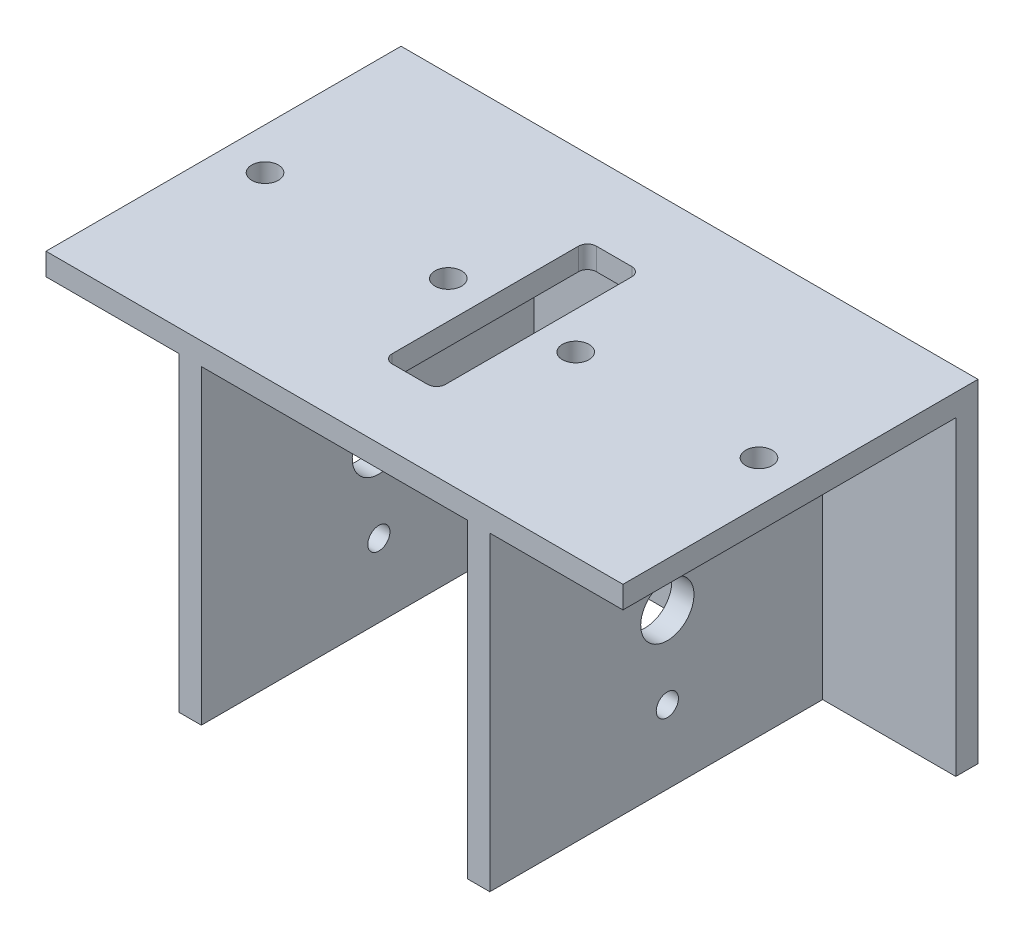
ISO-10303-21;
HEADER;
FILE_DESCRIPTION(('STEP AP214'),'2;1');
FILE_NAME('part.step','',(''),(''),'','','');
FILE_SCHEMA(('AUTOMOTIVE_DESIGN { 1 0 10303 214 1 1 1 1 }'));
ENDSEC;
DATA;
#1=APPLICATION_CONTEXT('core data for automotive mechanical design processes');
#2=APPLICATION_PROTOCOL_DEFINITION('international standard','automotive_design',2000,#1);
#3=PRODUCT_CONTEXT('',#1,'mechanical');
#4=PRODUCT('Part','Part','',(#3));
#5=PRODUCT_RELATED_PRODUCT_CATEGORY('part','',(#4));
#6=PRODUCT_DEFINITION_FORMATION('','',#4);
#7=PRODUCT_DEFINITION_CONTEXT('part definition',#1,'design');
#8=PRODUCT_DEFINITION('design','',#6,#7);
#9=PRODUCT_DEFINITION_SHAPE('','',#8);
#10=(LENGTH_UNIT() NAMED_UNIT(*) SI_UNIT(.MILLI.,.METRE.));
#11=(NAMED_UNIT(*) PLANE_ANGLE_UNIT() SI_UNIT($,.RADIAN.));
#12=(NAMED_UNIT(*) SI_UNIT($,.STERADIAN.) SOLID_ANGLE_UNIT());
#13=UNCERTAINTY_MEASURE_WITH_UNIT(LENGTH_MEASURE(1.E-05),#10,'distance_accuracy_value','');
#14=(GEOMETRIC_REPRESENTATION_CONTEXT(3) GLOBAL_UNCERTAINTY_ASSIGNED_CONTEXT((#13)) GLOBAL_UNIT_ASSIGNED_CONTEXT((#10,
#11,#12)) REPRESENTATION_CONTEXT('',''));
#15=CARTESIAN_POINT('',(0.,0.,0.));
#16=DIRECTION('',(0.,0.,1.));
#17=DIRECTION('',(1.,0.,0.));
#18=AXIS2_PLACEMENT_3D('',#15,#16,#17);
#19=CARTESIAN_POINT('',(0.,0.,0.));
#20=DIRECTION('',(0.,-1.,0.));
#21=DIRECTION('',(0.,0.,-1.));
#22=AXIS2_PLACEMENT_3D('',#19,#20,#21);
#23=PLANE('',#22);
#24=CARTESIAN_POINT('',(-14.35,0.,0.));
#25=DIRECTION('',(0.,1.,0.));
#26=DIRECTION('',(0.,0.,1.));
#27=AXIS2_PLACEMENT_3D('',#24,#25,#26);
#28=CIRCLE('',#27,3.);
#29=CARTESIAN_POINT('',(-14.35,0.,3.));
#30=VERTEX_POINT('',#29);
#31=EDGE_CURVE('E326',#30,#30,#28,.T.);
#32=ORIENTED_EDGE('',*,*,#31,.T.);
#33=EDGE_LOOP('',(#32));
#34=FACE_BOUND('',#33,.T.);
#35=CARTESIAN_POINT('',(14.35,0.,0.));
#36=DIRECTION('',(0.,1.,0.));
#37=DIRECTION('',(0.,0.,-1.));
#38=AXIS2_PLACEMENT_3D('',#35,#36,#37);
#39=CIRCLE('',#38,3.);
#40=CARTESIAN_POINT('',(14.35,0.,-3.00000000000001));
#41=VERTEX_POINT('',#40);
#42=EDGE_CURVE('E291',#41,#41,#39,.T.);
#43=ORIENTED_EDGE('',*,*,#42,.T.);
#44=EDGE_LOOP('',(#43));
#45=FACE_BOUND('',#44,.T.);
#46=DIRECTION('',(0.,0.,-1.));
#47=VECTOR('',#46,1.);
#48=CARTESIAN_POINT('',(5.99999999999999,0.,-23.));
#49=LINE('',#48,#47);
#50=CARTESIAN_POINT('',(5.99999999999999,0.,21.));
#51=VERTEX_POINT('',#50);
#52=CARTESIAN_POINT('',(5.99999999999999,0.,-21.));
#53=VERTEX_POINT('',#52);
#54=EDGE_CURVE('E299',#51,#53,#49,.T.);
#55=ORIENTED_EDGE('',*,*,#54,.T.);
#56=CARTESIAN_POINT('',(3.99999999999999,0.,-21.));
#57=DIRECTION('',(0.,-1.,0.));
#58=DIRECTION('',(0.,0.,-1.));
#59=AXIS2_PLACEMENT_3D('',#56,#57,#58);
#60=CIRCLE('',#59,2.);
#61=CARTESIAN_POINT('',(3.99999999999999,0.,-23.));
#62=VERTEX_POINT('',#61);
#63=EDGE_CURVE('E415',#53,#62,#60,.F.);
#64=ORIENTED_EDGE('',*,*,#63,.T.);
#65=DIRECTION('',(-1.,0.,0.));
#66=VECTOR('',#65,1.);
#67=CARTESIAN_POINT('',(5.99999999999999,0.,-23.));
#68=LINE('',#67,#66);
#69=CARTESIAN_POINT('',(-4.,0.,-23.));
#70=VERTEX_POINT('',#69);
#71=EDGE_CURVE('E279',#62,#70,#68,.T.);
#72=ORIENTED_EDGE('',*,*,#71,.T.);
#73=CARTESIAN_POINT('',(-4.,0.,-21.));
#74=DIRECTION('',(0.,-1.,0.));
#75=DIRECTION('',(0.,0.,-1.));
#76=AXIS2_PLACEMENT_3D('',#73,#74,#75);
#77=CIRCLE('',#76,2.);
#78=CARTESIAN_POINT('',(-6.,0.,-21.));
#79=VERTEX_POINT('',#78);
#80=EDGE_CURVE('E53',#70,#79,#77,.F.);
#81=ORIENTED_EDGE('',*,*,#80,.T.);
#82=DIRECTION('',(0.,0.,1.));
#83=VECTOR('',#82,1.);
#84=CARTESIAN_POINT('',(-6.,0.,-23.));
#85=LINE('',#84,#83);
#86=CARTESIAN_POINT('',(-6.,0.,21.));
#87=VERTEX_POINT('',#86);
#88=EDGE_CURVE('E271',#79,#87,#85,.T.);
#89=ORIENTED_EDGE('',*,*,#88,.T.);
#90=CARTESIAN_POINT('',(-4.,0.,21.));
#91=DIRECTION('',(0.,-1.,0.));
#92=DIRECTION('',(0.,0.,-1.));
#93=AXIS2_PLACEMENT_3D('',#90,#91,#92);
#94=CIRCLE('',#93,2.);
#95=CARTESIAN_POINT('',(-4.,0.,23.));
#96=VERTEX_POINT('',#95);
#97=EDGE_CURVE('E409',#87,#96,#94,.F.);
#98=ORIENTED_EDGE('',*,*,#97,.T.);
#99=DIRECTION('',(1.,0.,0.));
#100=VECTOR('',#99,1.);
#101=CARTESIAN_POINT('',(5.99999999999999,0.,23.));
#102=LINE('',#101,#100);
#103=CARTESIAN_POINT('',(3.99999999999999,0.,23.));
#104=VERTEX_POINT('',#103);
#105=EDGE_CURVE('E295',#96,#104,#102,.T.);
#106=ORIENTED_EDGE('',*,*,#105,.T.);
#107=CARTESIAN_POINT('',(3.99999999999999,0.,21.));
#108=DIRECTION('',(0.,-1.,0.));
#109=DIRECTION('',(0.,0.,-1.));
#110=AXIS2_PLACEMENT_3D('',#107,#108,#109);
#111=CIRCLE('',#110,2.);
#112=EDGE_CURVE('E403',#104,#51,#111,.F.);
#113=ORIENTED_EDGE('',*,*,#112,.T.);
#114=EDGE_LOOP('',(#55,#64,#72,#81,#89,#98,#106,#113));
#115=FACE_BOUND('',#114,.T.);
#116=DIRECTION('',(-1.,0.,0.));
#117=VECTOR('',#116,1.);
#118=CARTESIAN_POINT('',(-65.,0.,-35.));
#119=LINE('',#118,#117);
#120=CARTESIAN_POINT('',(30.,0.,-35.));
#121=VERTEX_POINT('',#120);
#122=CARTESIAN_POINT('',(-30.,0.,-35.));
#123=VERTEX_POINT('',#122);
#124=EDGE_CURVE('E226',#121,#123,#119,.T.);
#125=ORIENTED_EDGE('',*,*,#124,.F.);
#126=DIRECTION('',(0.,0.,-1.));
#127=VECTOR('',#126,1.);
#128=CARTESIAN_POINT('',(30.,0.,40.));
#129=LINE('',#128,#127);
#130=CARTESIAN_POINT('',(30.,0.,40.));
#131=VERTEX_POINT('',#130);
#132=EDGE_CURVE('E468',#131,#121,#129,.T.);
#133=ORIENTED_EDGE('',*,*,#132,.F.);
#134=DIRECTION('',(1.,0.,0.));
#135=VECTOR('',#134,1.);
#136=CARTESIAN_POINT('',(65.,0.,40.));
#137=LINE('',#136,#135);
#138=CARTESIAN_POINT('',(-30.,0.,40.));
#139=VERTEX_POINT('',#138);
#140=EDGE_CURVE('E361',#139,#131,#137,.T.);
#141=ORIENTED_EDGE('',*,*,#140,.F.);
#142=DIRECTION('',(0.,0.,-1.));
#143=VECTOR('',#142,1.);
#144=CARTESIAN_POINT('',(-30.,0.,40.));
#145=LINE('',#144,#143);
#146=EDGE_CURVE('E237',#139,#123,#145,.T.);
#147=ORIENTED_EDGE('',*,*,#146,.T.);
#148=EDGE_LOOP('',(#125,#133,#141,#147));
#149=FACE_BOUND('',#148,.T.);
#150=ADVANCED_FACE('F43',(#34,#45,#115,#149),#23,.T.);
#151=CARTESIAN_POINT('',(55.65,0.,0.));
#152=DIRECTION('',(0.,1.,0.));
#153=DIRECTION('',(0.,0.,-1.));
#154=AXIS2_PLACEMENT_3D('',#151,#152,#153);
#155=CIRCLE('',#154,3.);
#156=CARTESIAN_POINT('',(55.65,0.,-3.00000000000001));
#157=VERTEX_POINT('',#156);
#158=EDGE_CURVE('E310',#157,#157,#155,.T.);
#159=ORIENTED_EDGE('',*,*,#158,.T.);
#160=EDGE_LOOP('',(#159));
#161=FACE_BOUND('',#160,.T.);
#162=CARTESIAN_POINT('',(35.,0.,40.));
#163=VERTEX_POINT('',#162);
#164=CARTESIAN_POINT('',(65.,0.,40.));
#165=VERTEX_POINT('',#164);
#166=EDGE_CURVE('E216',#163,#165,#137,.T.);
#167=ORIENTED_EDGE('',*,*,#166,.F.);
#168=DIRECTION('',(0.,0.,-1.));
#169=VECTOR('',#168,1.);
#170=CARTESIAN_POINT('',(35.,0.,40.));
#171=LINE('',#170,#169);
#172=CARTESIAN_POINT('',(35.,0.,-35.));
#173=VERTEX_POINT('',#172);
#174=EDGE_CURVE('E199',#163,#173,#171,.T.);
#175=ORIENTED_EDGE('',*,*,#174,.T.);
#176=CARTESIAN_POINT('',(65.,0.,-35.));
#177=VERTEX_POINT('',#176);
#178=EDGE_CURVE('E214',#177,#173,#119,.T.);
#179=ORIENTED_EDGE('',*,*,#178,.F.);
#180=DIRECTION('',(0.,0.,-1.));
#181=VECTOR('',#180,1.);
#182=CARTESIAN_POINT('',(65.,0.,-40.));
#183=LINE('',#182,#181);
#184=EDGE_CURVE('E334',#165,#177,#183,.T.);
#185=ORIENTED_EDGE('',*,*,#184,.F.);
#186=EDGE_LOOP('',(#167,#175,#179,#185));
#187=FACE_BOUND('',#186,.T.);
#188=ADVANCED_FACE('F212',(#161,#187),#23,.T.);
#189=CARTESIAN_POINT('',(-65.,-70.,-35.));
#190=DIRECTION('',(0.,0.,-1.));
#191=DIRECTION('',(-1.,0.,0.));
#192=AXIS2_PLACEMENT_3D('',#189,#190,#191);
#193=PLANE('',#192);
#194=DIRECTION('',(0.,-1.,0.));
#195=VECTOR('',#194,1.);
#196=CARTESIAN_POINT('',(30.,0.,-35.));
#197=LINE('',#196,#195);
#198=CARTESIAN_POINT('',(30.,-70.,-35.));
#199=VERTEX_POINT('',#198);
#200=EDGE_CURVE('E208',#121,#199,#197,.T.);
#201=ORIENTED_EDGE('',*,*,#200,.F.);
#202=ORIENTED_EDGE('',*,*,#124,.T.);
#203=DIRECTION('',(0.,1.,0.));
#204=VECTOR('',#203,1.);
#205=CARTESIAN_POINT('',(-30.,0.,-35.));
#206=LINE('',#205,#204);
#207=CARTESIAN_POINT('',(-30.,-70.,-35.));
#208=VERTEX_POINT('',#207);
#209=EDGE_CURVE('E477',#208,#123,#206,.T.);
#210=ORIENTED_EDGE('',*,*,#209,.F.);
#211=DIRECTION('',(-1.,0.,0.));
#212=VECTOR('',#211,1.);
#213=CARTESIAN_POINT('',(-65.,-70.,-35.));
#214=LINE('',#213,#212);
#215=EDGE_CURVE('E261',#199,#208,#214,.T.);
#216=ORIENTED_EDGE('',*,*,#215,.F.);
#217=EDGE_LOOP('',(#201,#202,#210,#216));
#218=FACE_BOUND('',#217,.T.);
#219=ADVANCED_FACE('F533',(#218),#193,.F.);
#220=DIRECTION('',(0.,1.,0.));
#221=VECTOR('',#220,1.);
#222=CARTESIAN_POINT('',(35.,0.,-35.));
#223=LINE('',#222,#221);
#224=CARTESIAN_POINT('',(35.,-70.,-35.));
#225=VERTEX_POINT('',#224);
#226=EDGE_CURVE('E195',#225,#173,#223,.T.);
#227=ORIENTED_EDGE('',*,*,#226,.F.);
#228=CARTESIAN_POINT('',(65.,-70.,-35.));
#229=VERTEX_POINT('',#228);
#230=EDGE_CURVE('E258',#229,#225,#214,.T.);
#231=ORIENTED_EDGE('',*,*,#230,.F.);
#232=DIRECTION('',(0.,1.,0.));
#233=VECTOR('',#232,1.);
#234=CARTESIAN_POINT('',(65.,-70.,-35.));
#235=LINE('',#234,#233);
#236=EDGE_CURVE('E223',#229,#177,#235,.T.);
#237=ORIENTED_EDGE('',*,*,#236,.T.);
#238=ORIENTED_EDGE('',*,*,#178,.T.);
#239=EDGE_LOOP('',(#227,#231,#237,#238));
#240=FACE_BOUND('',#239,.T.);
#241=ADVANCED_FACE('F221',(#240),#193,.F.);
#242=CARTESIAN_POINT('',(-55.65,0.,0.));
#243=DIRECTION('',(0.,1.,0.));
#244=DIRECTION('',(0.,0.,1.));
#245=AXIS2_PLACEMENT_3D('',#242,#243,#244);
#246=CIRCLE('',#245,3.);
#247=CARTESIAN_POINT('',(-55.65,0.,3.));
#248=VERTEX_POINT('',#247);
#249=EDGE_CURVE('E318',#248,#248,#246,.T.);
#250=ORIENTED_EDGE('',*,*,#249,.T.);
#251=EDGE_LOOP('',(#250));
#252=FACE_BOUND('',#251,.T.);
#253=CARTESIAN_POINT('',(-35.,0.,-35.));
#254=VERTEX_POINT('',#253);
#255=CARTESIAN_POINT('',(-65.,0.,-35.));
#256=VERTEX_POINT('',#255);
#257=EDGE_CURVE('E228',#254,#256,#119,.T.);
#258=ORIENTED_EDGE('',*,*,#257,.F.);
#259=DIRECTION('',(0.,0.,-1.));
#260=VECTOR('',#259,1.);
#261=CARTESIAN_POINT('',(-35.,0.,40.));
#262=LINE('',#261,#260);
#263=CARTESIAN_POINT('',(-35.,0.,40.));
#264=VERTEX_POINT('',#263);
#265=EDGE_CURVE('E245',#264,#254,#262,.T.);
#266=ORIENTED_EDGE('',*,*,#265,.F.);
#267=CARTESIAN_POINT('',(-65.,0.,40.));
#268=VERTEX_POINT('',#267);
#269=EDGE_CURVE('E343',#268,#264,#137,.T.);
#270=ORIENTED_EDGE('',*,*,#269,.F.);
#271=DIRECTION('',(0.,0.,1.));
#272=VECTOR('',#271,1.);
#273=CARTESIAN_POINT('',(-65.,0.,-40.));
#274=LINE('',#273,#272);
#275=EDGE_CURVE('E355',#256,#268,#274,.T.);
#276=ORIENTED_EDGE('',*,*,#275,.F.);
#277=EDGE_LOOP('',(#258,#266,#270,#276));
#278=FACE_BOUND('',#277,.T.);
#279=ADVANCED_FACE('F565',(#252,#278),#23,.T.);
#280=DIRECTION('',(0.,-1.,0.));
#281=VECTOR('',#280,1.);
#282=CARTESIAN_POINT('',(-35.,0.,-35.));
#283=LINE('',#282,#281);
#284=CARTESIAN_POINT('',(-35.,-70.,-35.));
#285=VERTEX_POINT('',#284);
#286=EDGE_CURVE('E489',#254,#285,#283,.T.);
#287=ORIENTED_EDGE('',*,*,#286,.F.);
#288=ORIENTED_EDGE('',*,*,#257,.T.);
#289=DIRECTION('',(0.,1.,0.));
#290=VECTOR('',#289,1.);
#291=CARTESIAN_POINT('',(-65.,-70.,-35.));
#292=LINE('',#291,#290);
#293=CARTESIAN_POINT('',(-65.,-70.,-35.));
#294=VERTEX_POINT('',#293);
#295=EDGE_CURVE('E264',#294,#256,#292,.T.);
#296=ORIENTED_EDGE('',*,*,#295,.F.);
#297=EDGE_CURVE('E257',#285,#294,#214,.T.);
#298=ORIENTED_EDGE('',*,*,#297,.F.);
#299=EDGE_LOOP('',(#287,#288,#296,#298));
#300=FACE_BOUND('',#299,.T.);
#301=ADVANCED_FACE('F539',(#300),#193,.F.);
#302=CARTESIAN_POINT('',(0.,5.,0.));
#303=DIRECTION('',(0.,-1.,0.));
#304=DIRECTION('',(0.,0.,-1.));
#305=AXIS2_PLACEMENT_3D('',#302,#303,#304);
#306=PLANE('',#305);
#307=CARTESIAN_POINT('',(14.35,5.,0.));
#308=DIRECTION('',(0.,1.,0.));
#309=DIRECTION('',(0.,0.,-1.));
#310=AXIS2_PLACEMENT_3D('',#307,#308,#309);
#311=CIRCLE('',#310,3.);
#312=CARTESIAN_POINT('',(14.35,5.,-3.00000000000001));
#313=VERTEX_POINT('',#312);
#314=EDGE_CURVE('E306',#313,#313,#311,.T.);
#315=ORIENTED_EDGE('',*,*,#314,.F.);
#316=EDGE_LOOP('',(#315));
#317=FACE_BOUND('',#316,.T.);
#318=CARTESIAN_POINT('',(55.65,5.,0.));
#319=DIRECTION('',(0.,1.,0.));
#320=DIRECTION('',(0.,0.,-1.));
#321=AXIS2_PLACEMENT_3D('',#318,#319,#320);
#322=CIRCLE('',#321,3.);
#323=CARTESIAN_POINT('',(55.65,5.,-3.00000000000001));
#324=VERTEX_POINT('',#323);
#325=EDGE_CURVE('E314',#324,#324,#322,.T.);
#326=ORIENTED_EDGE('',*,*,#325,.F.);
#327=EDGE_LOOP('',(#326));
#328=FACE_BOUND('',#327,.T.);
#329=CARTESIAN_POINT('',(-55.65,5.,0.));
#330=DIRECTION('',(0.,1.,0.));
#331=DIRECTION('',(0.,0.,1.));
#332=AXIS2_PLACEMENT_3D('',#329,#330,#331);
#333=CIRCLE('',#332,3.);
#334=CARTESIAN_POINT('',(-55.65,5.,3.));
#335=VERTEX_POINT('',#334);
#336=EDGE_CURVE('E322',#335,#335,#333,.T.);
#337=ORIENTED_EDGE('',*,*,#336,.F.);
#338=EDGE_LOOP('',(#337));
#339=FACE_BOUND('',#338,.T.);
#340=CARTESIAN_POINT('',(-14.35,5.,0.));
#341=DIRECTION('',(0.,1.,0.));
#342=DIRECTION('',(0.,0.,1.));
#343=AXIS2_PLACEMENT_3D('',#340,#341,#342);
#344=CIRCLE('',#343,3.);
#345=CARTESIAN_POINT('',(-14.35,5.,3.));
#346=VERTEX_POINT('',#345);
#347=EDGE_CURVE('E330',#346,#346,#344,.T.);
#348=ORIENTED_EDGE('',*,*,#347,.F.);
#349=EDGE_LOOP('',(#348));
#350=FACE_BOUND('',#349,.T.);
#351=DIRECTION('',(0.,0.,-1.));
#352=VECTOR('',#351,1.);
#353=CARTESIAN_POINT('',(65.,5.,-40.));
#354=LINE('',#353,#352);
#355=CARTESIAN_POINT('',(65.,5.,40.));
#356=VERTEX_POINT('',#355);
#357=CARTESIAN_POINT('',(65.,5.,-40.));
#358=VERTEX_POINT('',#357);
#359=EDGE_CURVE('E338',#356,#358,#354,.T.);
#360=ORIENTED_EDGE('',*,*,#359,.T.);
#361=DIRECTION('',(-1.,0.,0.));
#362=VECTOR('',#361,1.);
#363=CARTESIAN_POINT('',(65.,5.,-40.));
#364=LINE('',#363,#362);
#365=CARTESIAN_POINT('',(-65.,5.,-40.));
#366=VERTEX_POINT('',#365);
#367=EDGE_CURVE('E342',#358,#366,#364,.T.);
#368=ORIENTED_EDGE('',*,*,#367,.T.);
#369=DIRECTION('',(0.,0.,1.));
#370=VECTOR('',#369,1.);
#371=CARTESIAN_POINT('',(-65.,5.,-40.));
#372=LINE('',#371,#370);
#373=CARTESIAN_POINT('',(-65.,5.,40.));
#374=VERTEX_POINT('',#373);
#375=EDGE_CURVE('E346',#366,#374,#372,.T.);
#376=ORIENTED_EDGE('',*,*,#375,.T.);
#377=DIRECTION('',(1.,0.,0.));
#378=VECTOR('',#377,1.);
#379=CARTESIAN_POINT('',(65.,5.,40.));
#380=LINE('',#379,#378);
#381=EDGE_CURVE('E349',#374,#356,#380,.T.);
#382=ORIENTED_EDGE('',*,*,#381,.T.);
#383=EDGE_LOOP('',(#360,#368,#376,#382));
#384=FACE_BOUND('',#383,.T.);
#385=DIRECTION('',(0.,0.,1.));
#386=VECTOR('',#385,1.);
#387=CARTESIAN_POINT('',(-6.,5.,-23.));
#388=LINE('',#387,#386);
#389=CARTESIAN_POINT('',(-6.,5.,-21.));
#390=VERTEX_POINT('',#389);
#391=CARTESIAN_POINT('',(-6.,5.,21.));
#392=VERTEX_POINT('',#391);
#393=EDGE_CURVE('E274',#390,#392,#388,.T.);
#394=ORIENTED_EDGE('',*,*,#393,.F.);
#395=CARTESIAN_POINT('',(-4.,5.,-21.));
#396=DIRECTION('',(0.,-1.,0.));
#397=DIRECTION('',(0.,0.,-1.));
#398=AXIS2_PLACEMENT_3D('',#395,#396,#397);
#399=CIRCLE('',#398,2.);
#400=CARTESIAN_POINT('',(-4.,5.,-23.));
#401=VERTEX_POINT('',#400);
#402=EDGE_CURVE('E11',#390,#401,#399,.T.);
#403=ORIENTED_EDGE('',*,*,#402,.T.);
#404=DIRECTION('',(-1.,0.,0.));
#405=VECTOR('',#404,1.);
#406=CARTESIAN_POINT('',(5.99999999999999,5.,-23.));
#407=LINE('',#406,#405);
#408=CARTESIAN_POINT('',(3.99999999999999,5.,-23.));
#409=VERTEX_POINT('',#408);
#410=EDGE_CURVE('E287',#409,#401,#407,.T.);
#411=ORIENTED_EDGE('',*,*,#410,.F.);
#412=CARTESIAN_POINT('',(3.99999999999999,5.,-21.));
#413=DIRECTION('',(0.,-1.,0.));
#414=DIRECTION('',(0.,0.,-1.));
#415=AXIS2_PLACEMENT_3D('',#412,#413,#414);
#416=CIRCLE('',#415,2.);
#417=CARTESIAN_POINT('',(5.99999999999999,5.,-21.));
#418=VERTEX_POINT('',#417);
#419=EDGE_CURVE('E418',#409,#418,#416,.T.);
#420=ORIENTED_EDGE('',*,*,#419,.T.);
#421=DIRECTION('',(0.,0.,-1.));
#422=VECTOR('',#421,1.);
#423=CARTESIAN_POINT('',(5.99999999999999,5.,-23.));
#424=LINE('',#423,#422);
#425=CARTESIAN_POINT('',(5.99999999999999,5.,21.));
#426=VERTEX_POINT('',#425);
#427=EDGE_CURVE('E283',#426,#418,#424,.T.);
#428=ORIENTED_EDGE('',*,*,#427,.F.);
#429=CARTESIAN_POINT('',(3.99999999999999,5.,21.));
#430=DIRECTION('',(0.,-1.,0.));
#431=DIRECTION('',(0.,0.,-1.));
#432=AXIS2_PLACEMENT_3D('',#429,#430,#431);
#433=CIRCLE('',#432,2.);
#434=CARTESIAN_POINT('',(3.99999999999999,5.,23.));
#435=VERTEX_POINT('',#434);
#436=EDGE_CURVE('E406',#426,#435,#433,.T.);
#437=ORIENTED_EDGE('',*,*,#436,.T.);
#438=DIRECTION('',(1.,0.,0.));
#439=VECTOR('',#438,1.);
#440=CARTESIAN_POINT('',(5.99999999999999,5.,23.));
#441=LINE('',#440,#439);
#442=CARTESIAN_POINT('',(-4.,5.,23.));
#443=VERTEX_POINT('',#442);
#444=EDGE_CURVE('E278',#443,#435,#441,.T.);
#445=ORIENTED_EDGE('',*,*,#444,.F.);
#446=CARTESIAN_POINT('',(-4.,5.,21.));
#447=DIRECTION('',(0.,-1.,0.));
#448=DIRECTION('',(0.,0.,-1.));
#449=AXIS2_PLACEMENT_3D('',#446,#447,#448);
#450=CIRCLE('',#449,2.);
#451=EDGE_CURVE('E412',#443,#392,#450,.T.);
#452=ORIENTED_EDGE('',*,*,#451,.T.);
#453=EDGE_LOOP('',(#394,#403,#411,#420,#428,#437,#445,#452));
#454=FACE_BOUND('',#453,.T.);
#455=ADVANCED_FACE('F573',(#317,#328,#339,#350,#384,#454),#306,.F.);
#456=CARTESIAN_POINT('',(65.,5.,-40.));
#457=DIRECTION('',(-1.,0.,0.));
#458=DIRECTION('',(0.,0.,1.));
#459=AXIS2_PLACEMENT_3D('',#456,#457,#458);
#460=PLANE('',#459);
#461=ORIENTED_EDGE('',*,*,#184,.T.);
#462=ORIENTED_EDGE('',*,*,#236,.F.);
#463=DIRECTION('',(0.,0.,1.));
#464=VECTOR('',#463,1.);
#465=CARTESIAN_POINT('',(65.,-70.,-35.));
#466=LINE('',#465,#464);
#467=CARTESIAN_POINT('',(65.,-70.,-40.));
#468=VERTEX_POINT('',#467);
#469=EDGE_CURVE('E232',#468,#229,#466,.T.);
#470=ORIENTED_EDGE('',*,*,#469,.F.);
#471=DIRECTION('',(0.,-1.,0.));
#472=VECTOR('',#471,1.);
#473=CARTESIAN_POINT('',(65.,5.,-40.));
#474=LINE('',#473,#472);
#475=EDGE_CURVE('E372',#358,#468,#474,.T.);
#476=ORIENTED_EDGE('',*,*,#475,.F.);
#477=ORIENTED_EDGE('',*,*,#359,.F.);
#478=DIRECTION('',(0.,-1.,0.));
#479=VECTOR('',#478,1.);
#480=CARTESIAN_POINT('',(65.,5.,40.));
#481=LINE('',#480,#479);
#482=EDGE_CURVE('E352',#356,#165,#481,.T.);
#483=ORIENTED_EDGE('',*,*,#482,.T.);
#484=EDGE_LOOP('',(#461,#462,#470,#476,#477,#483));
#485=FACE_BOUND('',#484,.T.);
#486=ADVANCED_FACE('F549',(#485),#460,.F.);
#487=CARTESIAN_POINT('',(65.,5.,-40.));
#488=DIRECTION('',(0.,0.,1.));
#489=DIRECTION('',(1.,0.,0.));
#490=AXIS2_PLACEMENT_3D('',#487,#488,#489);
#491=PLANE('',#490);
#492=ORIENTED_EDGE('',*,*,#475,.T.);
#493=DIRECTION('',(1.,0.,0.));
#494=VECTOR('',#493,1.);
#495=CARTESIAN_POINT('',(65.,-70.,-40.));
#496=LINE('',#495,#494);
#497=CARTESIAN_POINT('',(-65.,-70.,-40.));
#498=VERTEX_POINT('',#497);
#499=EDGE_CURVE('E225',#498,#468,#496,.T.);
#500=ORIENTED_EDGE('',*,*,#499,.F.);
#501=DIRECTION('',(0.,-1.,0.));
#502=VECTOR('',#501,1.);
#503=CARTESIAN_POINT('',(-65.,5.,-40.));
#504=LINE('',#503,#502);
#505=EDGE_CURVE('E369',#366,#498,#504,.T.);
#506=ORIENTED_EDGE('',*,*,#505,.F.);
#507=ORIENTED_EDGE('',*,*,#367,.F.);
#508=EDGE_LOOP('',(#492,#500,#506,#507));
#509=FACE_BOUND('',#508,.T.);
#510=ADVANCED_FACE('F545',(#509),#491,.F.);
#511=CARTESIAN_POINT('',(-65.,5.,-40.));
#512=DIRECTION('',(1.,0.,0.));
#513=DIRECTION('',(0.,0.,-1.));
#514=AXIS2_PLACEMENT_3D('',#511,#512,#513);
#515=PLANE('',#514);
#516=ORIENTED_EDGE('',*,*,#505,.T.);
#517=DIRECTION('',(0.,0.,-1.));
#518=VECTOR('',#517,1.);
#519=CARTESIAN_POINT('',(-65.,-70.,-40.));
#520=LINE('',#519,#518);
#521=EDGE_CURVE('E260',#294,#498,#520,.T.);
#522=ORIENTED_EDGE('',*,*,#521,.F.);
#523=ORIENTED_EDGE('',*,*,#295,.T.);
#524=ORIENTED_EDGE('',*,*,#275,.T.);
#525=DIRECTION('',(0.,-1.,0.));
#526=VECTOR('',#525,1.);
#527=CARTESIAN_POINT('',(-65.,5.,40.));
#528=LINE('',#527,#526);
#529=EDGE_CURVE('E365',#374,#268,#528,.T.);
#530=ORIENTED_EDGE('',*,*,#529,.F.);
#531=ORIENTED_EDGE('',*,*,#375,.F.);
#532=EDGE_LOOP('',(#516,#522,#523,#524,#530,#531));
#533=FACE_BOUND('',#532,.T.);
#534=ADVANCED_FACE('F540',(#533),#515,.F.);
#535=CARTESIAN_POINT('',(65.,5.,40.));
#536=DIRECTION('',(0.,0.,-1.));
#537=DIRECTION('',(-1.,0.,0.));
#538=AXIS2_PLACEMENT_3D('',#535,#536,#537);
#539=PLANE('',#538);
#540=ORIENTED_EDGE('',*,*,#269,.T.);
#541=DIRECTION('',(0.,-1.,0.));
#542=VECTOR('',#541,1.);
#543=CARTESIAN_POINT('',(-35.,0.,40.));
#544=LINE('',#543,#542);
#545=CARTESIAN_POINT('',(-35.,-70.,40.));
#546=VERTEX_POINT('',#545);
#547=EDGE_CURVE('E488',#264,#546,#544,.T.);
#548=ORIENTED_EDGE('',*,*,#547,.T.);
#549=DIRECTION('',(1.,0.,0.));
#550=VECTOR('',#549,1.);
#551=CARTESIAN_POINT('',(-35.,-70.,40.));
#552=LINE('',#551,#550);
#553=CARTESIAN_POINT('',(-30.,-70.,40.));
#554=VERTEX_POINT('',#553);
#555=EDGE_CURVE('E492',#546,#554,#552,.T.);
#556=ORIENTED_EDGE('',*,*,#555,.T.);
#557=DIRECTION('',(0.,1.,0.));
#558=VECTOR('',#557,1.);
#559=CARTESIAN_POINT('',(-30.,0.,40.));
#560=LINE('',#559,#558);
#561=EDGE_CURVE('E485',#554,#139,#560,.T.);
#562=ORIENTED_EDGE('',*,*,#561,.T.);
#563=ORIENTED_EDGE('',*,*,#140,.T.);
#564=DIRECTION('',(0.,-1.,0.));
#565=VECTOR('',#564,1.);
#566=CARTESIAN_POINT('',(30.,0.,40.));
#567=LINE('',#566,#565);
#568=CARTESIAN_POINT('',(30.,-70.,40.));
#569=VERTEX_POINT('',#568);
#570=EDGE_CURVE('E209',#131,#569,#567,.T.);
#571=ORIENTED_EDGE('',*,*,#570,.T.);
#572=DIRECTION('',(1.,0.,0.));
#573=VECTOR('',#572,1.);
#574=CARTESIAN_POINT('',(35.,-70.,40.));
#575=LINE('',#574,#573);
#576=CARTESIAN_POINT('',(35.,-70.,40.));
#577=VERTEX_POINT('',#576);
#578=EDGE_CURVE('E480',#569,#577,#575,.T.);
#579=ORIENTED_EDGE('',*,*,#578,.T.);
#580=DIRECTION('',(0.,1.,0.));
#581=VECTOR('',#580,1.);
#582=CARTESIAN_POINT('',(35.,0.,40.));
#583=LINE('',#582,#581);
#584=EDGE_CURVE('E218',#577,#163,#583,.T.);
#585=ORIENTED_EDGE('',*,*,#584,.T.);
#586=ORIENTED_EDGE('',*,*,#166,.T.);
#587=ORIENTED_EDGE('',*,*,#482,.F.);
#588=ORIENTED_EDGE('',*,*,#381,.F.);
#589=ORIENTED_EDGE('',*,*,#529,.T.);
#590=EDGE_LOOP('',(#540,#548,#556,#562,#563,#571,#579,#585,#586,#587,#588,#589));
#591=FACE_BOUND('',#590,.T.);
#592=ADVANCED_FACE('F554',(#591),#539,.F.);
#593=CARTESIAN_POINT('',(-14.35,5.,0.));
#594=DIRECTION('',(0.,-1.,0.));
#595=DIRECTION('',(0.,0.,-1.));
#596=AXIS2_PLACEMENT_3D('',#593,#594,#595);
#597=CYLINDRICAL_SURFACE('',#596,3.);
#598=ORIENTED_EDGE('',*,*,#347,.T.);
#599=EDGE_LOOP('',(#598));
#600=FACE_BOUND('',#599,.T.);
#601=ORIENTED_EDGE('',*,*,#31,.F.);
#602=EDGE_LOOP('',(#601));
#603=FACE_BOUND('',#602,.T.);
#604=ADVANCED_FACE('F599',(#600,#603),#597,.F.);
#605=CARTESIAN_POINT('',(-55.65,5.,0.));
#606=DIRECTION('',(0.,-1.,0.));
#607=DIRECTION('',(0.,0.,-1.));
#608=AXIS2_PLACEMENT_3D('',#605,#606,#607);
#609=CYLINDRICAL_SURFACE('',#608,3.);
#610=ORIENTED_EDGE('',*,*,#336,.T.);
#611=EDGE_LOOP('',(#610));
#612=FACE_BOUND('',#611,.T.);
#613=ORIENTED_EDGE('',*,*,#249,.F.);
#614=EDGE_LOOP('',(#613));
#615=FACE_BOUND('',#614,.T.);
#616=ADVANCED_FACE('F589',(#612,#615),#609,.F.);
#617=CARTESIAN_POINT('',(55.65,5.,0.));
#618=DIRECTION('',(0.,-1.,0.));
#619=DIRECTION('',(0.,0.,-1.));
#620=AXIS2_PLACEMENT_3D('',#617,#618,#619);
#621=CYLINDRICAL_SURFACE('',#620,3.);
#622=ORIENTED_EDGE('',*,*,#325,.T.);
#623=EDGE_LOOP('',(#622));
#624=FACE_BOUND('',#623,.T.);
#625=ORIENTED_EDGE('',*,*,#158,.F.);
#626=EDGE_LOOP('',(#625));
#627=FACE_BOUND('',#626,.T.);
#628=ADVANCED_FACE('F586',(#624,#627),#621,.F.);
#629=CARTESIAN_POINT('',(14.35,5.,0.));
#630=DIRECTION('',(0.,-1.,0.));
#631=DIRECTION('',(0.,0.,-1.));
#632=AXIS2_PLACEMENT_3D('',#629,#630,#631);
#633=CYLINDRICAL_SURFACE('',#632,3.);
#634=ORIENTED_EDGE('',*,*,#314,.T.);
#635=EDGE_LOOP('',(#634));
#636=FACE_BOUND('',#635,.T.);
#637=ORIENTED_EDGE('',*,*,#42,.F.);
#638=EDGE_LOOP('',(#637));
#639=FACE_BOUND('',#638,.T.);
#640=ADVANCED_FACE('F588',(#636,#639),#633,.F.);
#641=CARTESIAN_POINT('',(-6.,5.,-23.));
#642=DIRECTION('',(1.,0.,0.));
#643=DIRECTION('',(0.,0.,-1.));
#644=AXIS2_PLACEMENT_3D('',#641,#642,#643);
#645=PLANE('',#644);
#646=ORIENTED_EDGE('',*,*,#393,.T.);
#647=DIRECTION('',(0.,-1.,0.));
#648=VECTOR('',#647,1.);
#649=CARTESIAN_POINT('',(-6.,0.,21.));
#650=LINE('',#649,#648);
#651=EDGE_CURVE('E392',#392,#87,#650,.T.);
#652=ORIENTED_EDGE('',*,*,#651,.T.);
#653=ORIENTED_EDGE('',*,*,#88,.F.);
#654=DIRECTION('',(0.,-1.,0.));
#655=VECTOR('',#654,1.);
#656=CARTESIAN_POINT('',(-6.,5.,-21.));
#657=LINE('',#656,#655);
#658=EDGE_CURVE('E389',#79,#390,#657,.F.);
#659=ORIENTED_EDGE('',*,*,#658,.T.);
#660=EDGE_LOOP('',(#646,#652,#653,#659));
#661=FACE_BOUND('',#660,.T.);
#662=ADVANCED_FACE('F596',(#661),#645,.T.);
#663=CARTESIAN_POINT('',(5.99999999999999,5.,23.));
#664=DIRECTION('',(0.,0.,-1.));
#665=DIRECTION('',(-1.,0.,0.));
#666=AXIS2_PLACEMENT_3D('',#663,#664,#665);
#667=PLANE('',#666);
#668=ORIENTED_EDGE('',*,*,#444,.T.);
#669=DIRECTION('',(0.,-1.,0.));
#670=VECTOR('',#669,1.);
#671=CARTESIAN_POINT('',(3.99999999999999,0.,23.));
#672=LINE('',#671,#670);
#673=EDGE_CURVE('E378',#435,#104,#672,.T.);
#674=ORIENTED_EDGE('',*,*,#673,.T.);
#675=ORIENTED_EDGE('',*,*,#105,.F.);
#676=DIRECTION('',(0.,-1.,0.));
#677=VECTOR('',#676,1.);
#678=CARTESIAN_POINT('',(-4.,5.,23.));
#679=LINE('',#678,#677);
#680=EDGE_CURVE('E375',#96,#443,#679,.F.);
#681=ORIENTED_EDGE('',*,*,#680,.T.);
#682=EDGE_LOOP('',(#668,#674,#675,#681));
#683=FACE_BOUND('',#682,.T.);
#684=ADVANCED_FACE('F652',(#683),#667,.T.);
#685=CARTESIAN_POINT('',(5.99999999999999,5.,-23.));
#686=DIRECTION('',(-1.,0.,0.));
#687=DIRECTION('',(0.,0.,1.));
#688=AXIS2_PLACEMENT_3D('',#685,#686,#687);
#689=PLANE('',#688);
#690=ORIENTED_EDGE('',*,*,#54,.F.);
#691=DIRECTION('',(0.,-1.,0.));
#692=VECTOR('',#691,1.);
#693=CARTESIAN_POINT('',(5.99999999999999,5.,21.));
#694=LINE('',#693,#692);
#695=EDGE_CURVE('E386',#51,#426,#694,.F.);
#696=ORIENTED_EDGE('',*,*,#695,.T.);
#697=ORIENTED_EDGE('',*,*,#427,.T.);
#698=DIRECTION('',(0.,-1.,0.));
#699=VECTOR('',#698,1.);
#700=CARTESIAN_POINT('',(5.99999999999999,0.,-21.));
#701=LINE('',#700,#699);
#702=EDGE_CURVE('E382',#418,#53,#701,.T.);
#703=ORIENTED_EDGE('',*,*,#702,.T.);
#704=EDGE_LOOP('',(#690,#696,#697,#703));
#705=FACE_BOUND('',#704,.T.);
#706=ADVANCED_FACE('F643',(#705),#689,.T.);
#707=CARTESIAN_POINT('',(5.99999999999999,5.,-23.));
#708=DIRECTION('',(0.,0.,1.));
#709=DIRECTION('',(1.,0.,0.));
#710=AXIS2_PLACEMENT_3D('',#707,#708,#709);
#711=PLANE('',#710);
#712=ORIENTED_EDGE('',*,*,#71,.F.);
#713=DIRECTION('',(0.,-1.,0.));
#714=VECTOR('',#713,1.);
#715=CARTESIAN_POINT('',(3.99999999999999,5.,-23.));
#716=LINE('',#715,#714);
#717=EDGE_CURVE('E400',#62,#409,#716,.F.);
#718=ORIENTED_EDGE('',*,*,#717,.T.);
#719=ORIENTED_EDGE('',*,*,#410,.T.);
#720=DIRECTION('',(0.,-1.,0.));
#721=VECTOR('',#720,1.);
#722=CARTESIAN_POINT('',(-4.,0.,-23.));
#723=LINE('',#722,#721);
#724=EDGE_CURVE('E396',#401,#70,#723,.T.);
#725=ORIENTED_EDGE('',*,*,#724,.T.);
#726=EDGE_LOOP('',(#712,#718,#719,#725));
#727=FACE_BOUND('',#726,.T.);
#728=ADVANCED_FACE('F633',(#727),#711,.T.);
#729=CARTESIAN_POINT('',(3.99999999999999,5.,21.));
#730=DIRECTION('',(0.,1.,0.));
#731=DIRECTION('',(0.,0.,1.));
#732=AXIS2_PLACEMENT_3D('',#729,#730,#731);
#733=CYLINDRICAL_SURFACE('',#732,2.);
#734=ORIENTED_EDGE('',*,*,#436,.F.);
#735=ORIENTED_EDGE('',*,*,#695,.F.);
#736=ORIENTED_EDGE('',*,*,#112,.F.);
#737=ORIENTED_EDGE('',*,*,#673,.F.);
#738=EDGE_LOOP('',(#734,#735,#736,#737));
#739=FACE_BOUND('',#738,.T.);
#740=ADVANCED_FACE('F649',(#739),#733,.F.);
#741=CARTESIAN_POINT('',(-4.,5.,21.));
#742=DIRECTION('',(0.,1.,0.));
#743=DIRECTION('',(0.,0.,1.));
#744=AXIS2_PLACEMENT_3D('',#741,#742,#743);
#745=CYLINDRICAL_SURFACE('',#744,2.);
#746=ORIENTED_EDGE('',*,*,#451,.F.);
#747=ORIENTED_EDGE('',*,*,#680,.F.);
#748=ORIENTED_EDGE('',*,*,#97,.F.);
#749=ORIENTED_EDGE('',*,*,#651,.F.);
#750=EDGE_LOOP('',(#746,#747,#748,#749));
#751=FACE_BOUND('',#750,.T.);
#752=ADVANCED_FACE('F655',(#751),#745,.F.);
#753=CARTESIAN_POINT('',(3.99999999999999,5.,-21.));
#754=DIRECTION('',(0.,1.,0.));
#755=DIRECTION('',(0.,0.,1.));
#756=AXIS2_PLACEMENT_3D('',#753,#754,#755);
#757=CYLINDRICAL_SURFACE('',#756,2.);
#758=ORIENTED_EDGE('',*,*,#419,.F.);
#759=ORIENTED_EDGE('',*,*,#717,.F.);
#760=ORIENTED_EDGE('',*,*,#63,.F.);
#761=ORIENTED_EDGE('',*,*,#702,.F.);
#762=EDGE_LOOP('',(#758,#759,#760,#761));
#763=FACE_BOUND('',#762,.T.);
#764=ADVANCED_FACE('F641',(#763),#757,.F.);
#765=CARTESIAN_POINT('',(-4.,5.,-21.));
#766=DIRECTION('',(0.,1.,0.));
#767=DIRECTION('',(0.,0.,1.));
#768=AXIS2_PLACEMENT_3D('',#765,#766,#767);
#769=CYLINDRICAL_SURFACE('',#768,2.);
#770=ORIENTED_EDGE('',*,*,#402,.F.);
#771=ORIENTED_EDGE('',*,*,#658,.F.);
#772=ORIENTED_EDGE('',*,*,#80,.F.);
#773=ORIENTED_EDGE('',*,*,#724,.F.);
#774=EDGE_LOOP('',(#770,#771,#772,#773));
#775=FACE_BOUND('',#774,.T.);
#776=ADVANCED_FACE('F45',(#775),#769,.F.);
#777=CARTESIAN_POINT('',(0.,-70.,0.));
#778=DIRECTION('',(0.,1.,0.));
#779=DIRECTION('',(0.,0.,1.));
#780=AXIS2_PLACEMENT_3D('',#777,#778,#779);
#781=PLANE('',#780);
#782=ORIENTED_EDGE('',*,*,#499,.T.);
#783=ORIENTED_EDGE('',*,*,#469,.T.);
#784=ORIENTED_EDGE('',*,*,#230,.T.);
#785=DIRECTION('',(0.,0.,-1.));
#786=VECTOR('',#785,1.);
#787=CARTESIAN_POINT('',(35.,-70.,40.));
#788=LINE('',#787,#786);
#789=EDGE_CURVE('E202',#577,#225,#788,.T.);
#790=ORIENTED_EDGE('',*,*,#789,.F.);
#791=ORIENTED_EDGE('',*,*,#578,.F.);
#792=DIRECTION('',(0.,0.,-1.));
#793=VECTOR('',#792,1.);
#794=CARTESIAN_POINT('',(30.,-70.,40.));
#795=LINE('',#794,#793);
#796=EDGE_CURVE('E61',#569,#199,#795,.T.);
#797=ORIENTED_EDGE('',*,*,#796,.T.);
#798=ORIENTED_EDGE('',*,*,#215,.T.);
#799=DIRECTION('',(0.,0.,-1.));
#800=VECTOR('',#799,1.);
#801=CARTESIAN_POINT('',(-30.,-70.,40.));
#802=LINE('',#801,#800);
#803=EDGE_CURVE('E495',#554,#208,#802,.T.);
#804=ORIENTED_EDGE('',*,*,#803,.F.);
#805=ORIENTED_EDGE('',*,*,#555,.F.);
#806=DIRECTION('',(0.,0.,-1.));
#807=VECTOR('',#806,1.);
#808=CARTESIAN_POINT('',(-35.,-70.,40.));
#809=LINE('',#808,#807);
#810=EDGE_CURVE('E68',#546,#285,#809,.T.);
#811=ORIENTED_EDGE('',*,*,#810,.T.);
#812=ORIENTED_EDGE('',*,*,#297,.T.);
#813=ORIENTED_EDGE('',*,*,#521,.T.);
#814=EDGE_LOOP('',(#782,#783,#784,#790,#791,#797,#798,#804,#805,#811,#812,#813));
#815=FACE_BOUND('',#814,.T.);
#816=ADVANCED_FACE('F538',(#815),#781,.F.);
#817=CARTESIAN_POINT('',(-30.,0.,40.));
#818=DIRECTION('',(-1.,0.,0.));
#819=DIRECTION('',(0.,-1.,0.));
#820=AXIS2_PLACEMENT_3D('',#817,#818,#819);
#821=PLANE('',#820);
#822=CARTESIAN_POINT('',(-30.,-53.5,0.));
#823=DIRECTION('',(-1.,0.,0.));
#824=DIRECTION('',(0.,-1.,0.));
#825=AXIS2_PLACEMENT_3D('',#822,#823,#824);
#826=CIRCLE('',#825,2.5);
#827=CARTESIAN_POINT('',(-30.,-56.,0.));
#828=VERTEX_POINT('',#827);
#829=EDGE_CURVE('E464',#828,#828,#826,.T.);
#830=ORIENTED_EDGE('',*,*,#829,.T.);
#831=EDGE_LOOP('',(#830));
#832=FACE_BOUND('',#831,.T.);
#833=CARTESIAN_POINT('',(-30.,-16.5,0.));
#834=DIRECTION('',(-1.,0.,0.));
#835=DIRECTION('',(0.,-1.,0.));
#836=AXIS2_PLACEMENT_3D('',#833,#834,#835);
#837=CIRCLE('',#836,2.5);
#838=CARTESIAN_POINT('',(-30.,-19.,0.));
#839=VERTEX_POINT('',#838);
#840=EDGE_CURVE('E452',#839,#839,#837,.T.);
#841=ORIENTED_EDGE('',*,*,#840,.T.);
#842=EDGE_LOOP('',(#841));
#843=FACE_BOUND('',#842,.T.);
#844=CARTESIAN_POINT('',(-30.,-35.,0.));
#845=DIRECTION('',(-1.,0.,0.));
#846=DIRECTION('',(0.,-1.,0.));
#847=AXIS2_PLACEMENT_3D('',#844,#845,#846);
#848=CIRCLE('',#847,6.);
#849=CARTESIAN_POINT('',(-30.,-41.,0.));
#850=VERTEX_POINT('',#849);
#851=EDGE_CURVE('E431',#850,#850,#848,.T.);
#852=ORIENTED_EDGE('',*,*,#851,.T.);
#853=EDGE_LOOP('',(#852));
#854=FACE_BOUND('',#853,.T.);
#855=ORIENTED_EDGE('',*,*,#209,.T.);
#856=ORIENTED_EDGE('',*,*,#146,.F.);
#857=ORIENTED_EDGE('',*,*,#561,.F.);
#858=ORIENTED_EDGE('',*,*,#803,.T.);
#859=EDGE_LOOP('',(#855,#856,#857,#858));
#860=FACE_BOUND('',#859,.T.);
#861=ADVANCED_FACE('F560',(#832,#843,#854,#860),#821,.F.);
#862=CARTESIAN_POINT('',(-35.,0.,40.));
#863=DIRECTION('',(1.,0.,0.));
#864=DIRECTION('',(0.,0.,-1.));
#865=AXIS2_PLACEMENT_3D('',#862,#863,#864);
#866=PLANE('',#865);
#867=CARTESIAN_POINT('',(-35.,-53.5,0.));
#868=DIRECTION('',(1.,0.,0.));
#869=DIRECTION('',(0.,0.,-1.));
#870=AXIS2_PLACEMENT_3D('',#867,#868,#869);
#871=CIRCLE('',#870,2.5);
#872=CARTESIAN_POINT('',(-35.,-53.5,-2.49999999999999));
#873=VERTEX_POINT('',#872);
#874=EDGE_CURVE('E460',#873,#873,#871,.T.);
#875=ORIENTED_EDGE('',*,*,#874,.T.);
#876=EDGE_LOOP('',(#875));
#877=FACE_BOUND('',#876,.T.);
#878=CARTESIAN_POINT('',(-35.,-16.5,0.));
#879=DIRECTION('',(1.,0.,0.));
#880=DIRECTION('',(0.,0.,-1.));
#881=AXIS2_PLACEMENT_3D('',#878,#879,#880);
#882=CIRCLE('',#881,2.5);
#883=CARTESIAN_POINT('',(-35.,-16.5,-2.5));
#884=VERTEX_POINT('',#883);
#885=EDGE_CURVE('E437',#884,#884,#882,.T.);
#886=ORIENTED_EDGE('',*,*,#885,.T.);
#887=EDGE_LOOP('',(#886));
#888=FACE_BOUND('',#887,.T.);
#889=CARTESIAN_POINT('',(-35.,-35.,0.));
#890=DIRECTION('',(1.,0.,0.));
#891=DIRECTION('',(0.,0.,-1.));
#892=AXIS2_PLACEMENT_3D('',#889,#890,#891);
#893=CIRCLE('',#892,6.);
#894=CARTESIAN_POINT('',(-35.,-35.,-6.));
#895=VERTEX_POINT('',#894);
#896=EDGE_CURVE('E440',#895,#895,#893,.T.);
#897=ORIENTED_EDGE('',*,*,#896,.T.);
#898=EDGE_LOOP('',(#897));
#899=FACE_BOUND('',#898,.T.);
#900=ORIENTED_EDGE('',*,*,#286,.T.);
#901=ORIENTED_EDGE('',*,*,#810,.F.);
#902=ORIENTED_EDGE('',*,*,#547,.F.);
#903=ORIENTED_EDGE('',*,*,#265,.T.);
#904=EDGE_LOOP('',(#900,#901,#902,#903));
#905=FACE_BOUND('',#904,.T.);
#906=ADVANCED_FACE('F521',(#877,#888,#899,#905),#866,.F.);
#907=CARTESIAN_POINT('',(30.,0.,40.));
#908=DIRECTION('',(1.,0.,0.));
#909=DIRECTION('',(0.,1.,0.));
#910=AXIS2_PLACEMENT_3D('',#907,#908,#909);
#911=PLANE('',#910);
#912=CARTESIAN_POINT('',(30.,-53.5,0.));
#913=DIRECTION('',(1.,0.,0.));
#914=DIRECTION('',(0.,1.,0.));
#915=AXIS2_PLACEMENT_3D('',#912,#913,#914);
#916=CIRCLE('',#915,2.5);
#917=CARTESIAN_POINT('',(30.,-51.,0.));
#918=VERTEX_POINT('',#917);
#919=EDGE_CURVE('E456',#918,#918,#916,.T.);
#920=ORIENTED_EDGE('',*,*,#919,.T.);
#921=EDGE_LOOP('',(#920));
#922=FACE_BOUND('',#921,.T.);
#923=CARTESIAN_POINT('',(30.,-16.5,0.));
#924=DIRECTION('',(1.,0.,0.));
#925=DIRECTION('',(0.,1.,0.));
#926=AXIS2_PLACEMENT_3D('',#923,#924,#925);
#927=CIRCLE('',#926,2.5);
#928=CARTESIAN_POINT('',(30.,-14.,0.));
#929=VERTEX_POINT('',#928);
#930=EDGE_CURVE('E430',#929,#929,#927,.T.);
#931=ORIENTED_EDGE('',*,*,#930,.T.);
#932=EDGE_LOOP('',(#931));
#933=FACE_BOUND('',#932,.T.);
#934=CARTESIAN_POINT('',(30.,-35.,0.));
#935=DIRECTION('',(1.,0.,0.));
#936=DIRECTION('',(0.,1.,0.));
#937=AXIS2_PLACEMENT_3D('',#934,#935,#936);
#938=CIRCLE('',#937,6.);
#939=CARTESIAN_POINT('',(30.,-29.,0.));
#940=VERTEX_POINT('',#939);
#941=EDGE_CURVE('E426',#940,#940,#938,.T.);
#942=ORIENTED_EDGE('',*,*,#941,.T.);
#943=EDGE_LOOP('',(#942));
#944=FACE_BOUND('',#943,.T.);
#945=ORIENTED_EDGE('',*,*,#200,.T.);
#946=ORIENTED_EDGE('',*,*,#796,.F.);
#947=ORIENTED_EDGE('',*,*,#570,.F.);
#948=ORIENTED_EDGE('',*,*,#132,.T.);
#949=EDGE_LOOP('',(#945,#946,#947,#948));
#950=FACE_BOUND('',#949,.T.);
#951=ADVANCED_FACE('F518',(#922,#933,#944,#950),#911,.F.);
#952=CARTESIAN_POINT('',(35.,0.,40.));
#953=DIRECTION('',(-1.,0.,0.));
#954=DIRECTION('',(0.,-1.,0.));
#955=AXIS2_PLACEMENT_3D('',#952,#953,#954);
#956=PLANE('',#955);
#957=CARTESIAN_POINT('',(35.,-53.5,0.));
#958=DIRECTION('',(-1.,0.,0.));
#959=DIRECTION('',(0.,-1.,0.));
#960=AXIS2_PLACEMENT_3D('',#957,#958,#959);
#961=CIRCLE('',#960,2.5);
#962=CARTESIAN_POINT('',(35.,-56.,0.));
#963=VERTEX_POINT('',#962);
#964=EDGE_CURVE('E47',#963,#963,#961,.T.);
#965=ORIENTED_EDGE('',*,*,#964,.T.);
#966=EDGE_LOOP('',(#965));
#967=FACE_BOUND('',#966,.T.);
#968=CARTESIAN_POINT('',(35.,-16.5,0.));
#969=DIRECTION('',(-1.,0.,0.));
#970=DIRECTION('',(0.,-1.,0.));
#971=AXIS2_PLACEMENT_3D('',#968,#969,#970);
#972=CIRCLE('',#971,2.5);
#973=CARTESIAN_POINT('',(35.,-19.,0.));
#974=VERTEX_POINT('',#973);
#975=EDGE_CURVE('E427',#974,#974,#972,.T.);
#976=ORIENTED_EDGE('',*,*,#975,.T.);
#977=EDGE_LOOP('',(#976));
#978=FACE_BOUND('',#977,.T.);
#979=CARTESIAN_POINT('',(35.,-35.,0.));
#980=DIRECTION('',(-1.,0.,0.));
#981=DIRECTION('',(0.,-1.,0.));
#982=AXIS2_PLACEMENT_3D('',#979,#980,#981);
#983=CIRCLE('',#982,6.);
#984=CARTESIAN_POINT('',(35.,-41.,0.));
#985=VERTEX_POINT('',#984);
#986=EDGE_CURVE('E423',#985,#985,#983,.T.);
#987=ORIENTED_EDGE('',*,*,#986,.T.);
#988=EDGE_LOOP('',(#987));
#989=FACE_BOUND('',#988,.T.);
#990=ORIENTED_EDGE('',*,*,#226,.T.);
#991=ORIENTED_EDGE('',*,*,#174,.F.);
#992=ORIENTED_EDGE('',*,*,#584,.F.);
#993=ORIENTED_EDGE('',*,*,#789,.T.);
#994=EDGE_LOOP('',(#990,#991,#992,#993));
#995=FACE_BOUND('',#994,.T.);
#996=ADVANCED_FACE('F197',(#967,#978,#989,#995),#956,.F.);
#997=CARTESIAN_POINT('',(65.,-35.,0.));
#998=DIRECTION('',(-1.,0.,0.));
#999=DIRECTION('',(0.,0.,1.));
#1000=AXIS2_PLACEMENT_3D('',#997,#998,#999);
#1001=CYLINDRICAL_SURFACE('',#1000,6.);
#1002=ORIENTED_EDGE('',*,*,#986,.F.);
#1003=EDGE_LOOP('',(#1002));
#1004=FACE_BOUND('',#1003,.T.);
#1005=ORIENTED_EDGE('',*,*,#941,.F.);
#1006=EDGE_LOOP('',(#1005));
#1007=FACE_BOUND('',#1006,.T.);
#1008=ADVANCED_FACE('F675',(#1004,#1007),#1001,.F.);
#1009=CARTESIAN_POINT('',(65.,-16.5,0.));
#1010=DIRECTION('',(-1.,0.,0.));
#1011=DIRECTION('',(0.,0.,1.));
#1012=AXIS2_PLACEMENT_3D('',#1009,#1010,#1011);
#1013=CYLINDRICAL_SURFACE('',#1012,2.5);
#1014=ORIENTED_EDGE('',*,*,#975,.F.);
#1015=EDGE_LOOP('',(#1014));
#1016=FACE_BOUND('',#1015,.T.);
#1017=ORIENTED_EDGE('',*,*,#930,.F.);
#1018=EDGE_LOOP('',(#1017));
#1019=FACE_BOUND('',#1018,.T.);
#1020=ADVANCED_FACE('F513',(#1016,#1019),#1013,.F.);
#1021=CARTESIAN_POINT('',(65.,-53.5,0.));
#1022=DIRECTION('',(-1.,0.,0.));
#1023=DIRECTION('',(0.,0.,1.));
#1024=AXIS2_PLACEMENT_3D('',#1021,#1022,#1023);
#1025=CYLINDRICAL_SURFACE('',#1024,2.5);
#1026=ORIENTED_EDGE('',*,*,#964,.F.);
#1027=EDGE_LOOP('',(#1026));
#1028=FACE_BOUND('',#1027,.T.);
#1029=ORIENTED_EDGE('',*,*,#919,.F.);
#1030=EDGE_LOOP('',(#1029));
#1031=FACE_BOUND('',#1030,.T.);
#1032=ADVANCED_FACE('F509',(#1028,#1031),#1025,.F.);
#1033=ORIENTED_EDGE('',*,*,#896,.F.);
#1034=EDGE_LOOP('',(#1033));
#1035=FACE_BOUND('',#1034,.T.);
#1036=ORIENTED_EDGE('',*,*,#851,.F.);
#1037=EDGE_LOOP('',(#1036));
#1038=FACE_BOUND('',#1037,.T.);
#1039=ADVANCED_FACE('F512',(#1035,#1038),#1001,.F.);
#1040=ORIENTED_EDGE('',*,*,#885,.F.);
#1041=EDGE_LOOP('',(#1040));
#1042=FACE_BOUND('',#1041,.T.);
#1043=ORIENTED_EDGE('',*,*,#840,.F.);
#1044=EDGE_LOOP('',(#1043));
#1045=FACE_BOUND('',#1044,.T.);
#1046=ADVANCED_FACE('F678',(#1042,#1045),#1013,.F.);
#1047=ORIENTED_EDGE('',*,*,#874,.F.);
#1048=EDGE_LOOP('',(#1047));
#1049=FACE_BOUND('',#1048,.T.);
#1050=ORIENTED_EDGE('',*,*,#829,.F.);
#1051=EDGE_LOOP('',(#1050));
#1052=FACE_BOUND('',#1051,.T.);
#1053=ADVANCED_FACE('F515',(#1049,#1052),#1025,.F.);
#1054=CLOSED_SHELL('',(#150,#188,#219,#241,#279,#301,#455,#486,#510,#534,#592,#604,#616,#628,
#640,#662,#684,#706,#728,#740,#752,#764,#776,#816,#861,#906,#951,#996,#1008,#1020,#1032,#1039,
#1046,#1053));
#1055=MANIFOLD_SOLID_BREP('B2',#1054);
#1056=ADVANCED_BREP_SHAPE_REPRESENTATION('',(#18,#1055),#14);
#1057=SHAPE_DEFINITION_REPRESENTATION(#9,#1056);
ENDSEC;
END-ISO-10303-21;
